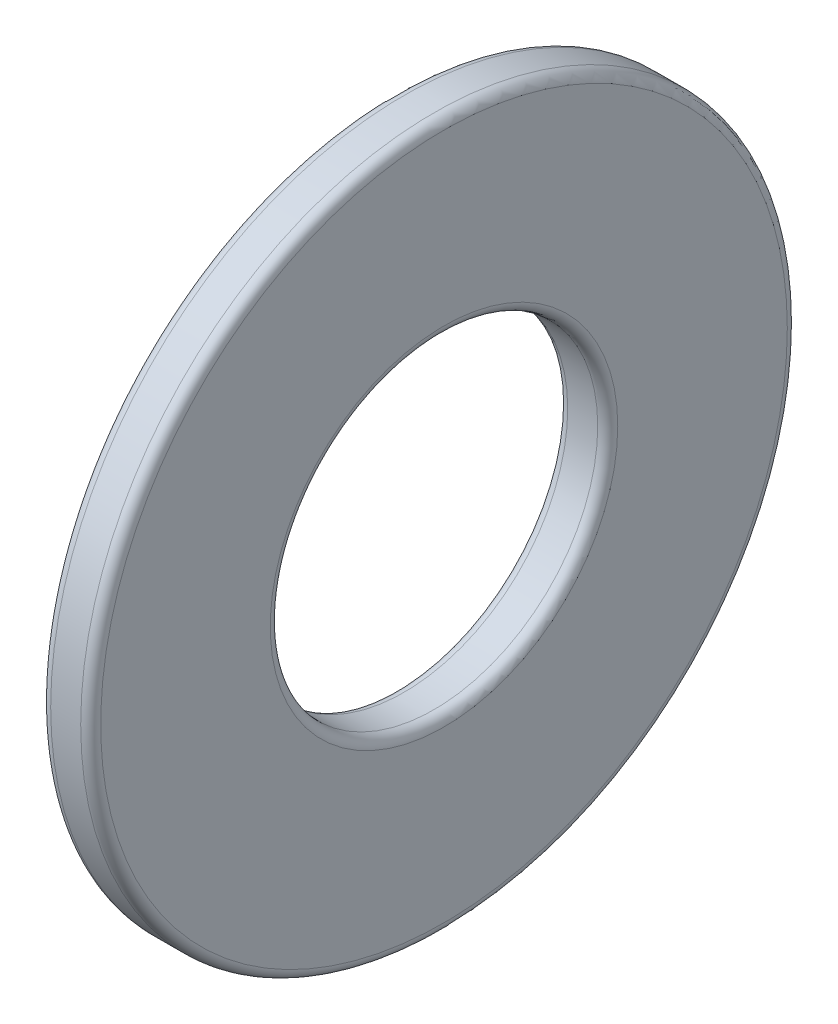
ISO-10303-21;
HEADER;
FILE_DESCRIPTION(('STEP AP214'),'2;1');
FILE_NAME('part.step','',(''),(''),'','','');
FILE_SCHEMA(('AUTOMOTIVE_DESIGN { 1 0 10303 214 1 1 1 1 }'));
ENDSEC;
DATA;
#1=APPLICATION_CONTEXT('core data for automotive mechanical design processes');
#2=APPLICATION_PROTOCOL_DEFINITION('international standard','automotive_design',2000,#1);
#3=PRODUCT_CONTEXT('',#1,'mechanical');
#4=PRODUCT('Part','Part','',(#3));
#5=PRODUCT_RELATED_PRODUCT_CATEGORY('part','',(#4));
#6=PRODUCT_DEFINITION_FORMATION('','',#4);
#7=PRODUCT_DEFINITION_CONTEXT('part definition',#1,'design');
#8=PRODUCT_DEFINITION('design','',#6,#7);
#9=PRODUCT_DEFINITION_SHAPE('','',#8);
#10=(LENGTH_UNIT() NAMED_UNIT(*) SI_UNIT(.MILLI.,.METRE.));
#11=(NAMED_UNIT(*) PLANE_ANGLE_UNIT() SI_UNIT($,.RADIAN.));
#12=(NAMED_UNIT(*) SI_UNIT($,.STERADIAN.) SOLID_ANGLE_UNIT());
#13=UNCERTAINTY_MEASURE_WITH_UNIT(LENGTH_MEASURE(1.E-05),#10,'distance_accuracy_value','');
#14=(GEOMETRIC_REPRESENTATION_CONTEXT(3) GLOBAL_UNCERTAINTY_ASSIGNED_CONTEXT((#13)) GLOBAL_UNIT_ASSIGNED_CONTEXT((#10,
#11,#12)) REPRESENTATION_CONTEXT('',''));
#15=CARTESIAN_POINT('',(0.,0.,0.));
#16=DIRECTION('',(0.,0.,1.));
#17=DIRECTION('',(1.,0.,0.));
#18=AXIS2_PLACEMENT_3D('',#15,#16,#17);
#19=CARTESIAN_POINT('',(0.3937,0.,0.));
#20=DIRECTION('',(1.,0.,0.));
#21=DIRECTION('',(0.,0.,-1.));
#22=AXIS2_PLACEMENT_3D('',#19,#20,#21);
#23=PLANE('',#22);
#24=CARTESIAN_POINT('',(0.3937,0.,0.));
#25=DIRECTION('',(1.,0.,0.));
#26=DIRECTION('',(0.,0.,-1.));
#27=AXIS2_PLACEMENT_3D('',#24,#25,#26);
#28=CIRCLE('',#27,5.40512000000002);
#29=CARTESIAN_POINT('',(0.3937,0.,-5.40512000000002));
#30=VERTEX_POINT('',#29);
#31=EDGE_CURVE('E62',#30,#30,#28,.T.);
#32=ORIENTED_EDGE('',*,*,#31,.T.);
#33=EDGE_LOOP('',(#32));
#34=FACE_BOUND('',#33,.T.);
#35=CARTESIAN_POINT('',(0.3937,0.,0.));
#36=DIRECTION('',(1.,0.,0.));
#37=DIRECTION('',(0.,0.,-1.));
#38=AXIS2_PLACEMENT_3D('',#35,#36,#37);
#39=CIRCLE('',#38,2.73558);
#40=CARTESIAN_POINT('',(0.3937,0.,-2.73558));
#41=VERTEX_POINT('',#40);
#42=EDGE_CURVE('E61',#41,#41,#39,.F.);
#43=ORIENTED_EDGE('',*,*,#42,.T.);
#44=EDGE_LOOP('',(#43));
#45=FACE_BOUND('',#44,.T.);
#46=ADVANCED_FACE('F34',(#34,#45),#23,.T.);
#47=CARTESIAN_POINT('',(-0.3937,0.,0.));
#48=DIRECTION('',(1.,0.,0.));
#49=DIRECTION('',(0.,0.,-1.));
#50=AXIS2_PLACEMENT_3D('',#47,#48,#49);
#51=PLANE('',#50);
#52=CARTESIAN_POINT('',(-0.3937,0.,0.));
#53=DIRECTION('',(1.,0.,0.));
#54=DIRECTION('',(0.,0.,-1.));
#55=AXIS2_PLACEMENT_3D('',#52,#53,#54);
#56=CIRCLE('',#55,5.40512000000002);
#57=CARTESIAN_POINT('',(-0.3937,0.,-5.40512000000002));
#58=VERTEX_POINT('',#57);
#59=EDGE_CURVE('E46',#58,#58,#56,.F.);
#60=ORIENTED_EDGE('',*,*,#59,.T.);
#61=EDGE_LOOP('',(#60));
#62=FACE_BOUND('',#61,.T.);
#63=CARTESIAN_POINT('',(-0.3937,0.,0.));
#64=DIRECTION('',(1.,0.,0.));
#65=DIRECTION('',(0.,0.,-1.));
#66=AXIS2_PLACEMENT_3D('',#63,#64,#65);
#67=CIRCLE('',#66,2.73558);
#68=CARTESIAN_POINT('',(-0.3937,0.,-2.73558));
#69=VERTEX_POINT('',#68);
#70=EDGE_CURVE('E49',#69,#69,#67,.T.);
#71=ORIENTED_EDGE('',*,*,#70,.T.);
#72=EDGE_LOOP('',(#71));
#73=FACE_BOUND('',#72,.T.);
#74=ADVANCED_FACE('F85',(#62,#73),#51,.F.);
#75=CARTESIAN_POINT('',(0.3937,0.,0.));
#76=DIRECTION('',(-1.,0.,0.));
#77=DIRECTION('',(0.,0.,1.));
#78=AXIS2_PLACEMENT_3D('',#75,#76,#77);
#79=CYLINDRICAL_SURFACE('',#78,5.56260000000002);
#80=CARTESIAN_POINT('',(0.23622,0.,0.));
#81=DIRECTION('',(1.,0.,0.));
#82=DIRECTION('',(0.,0.,-1.));
#83=AXIS2_PLACEMENT_3D('',#80,#81,#82);
#84=CIRCLE('',#83,5.56260000000002);
#85=CARTESIAN_POINT('',(0.23622,0.,-5.56260000000002));
#86=VERTEX_POINT('',#85);
#87=EDGE_CURVE('E54',#86,#86,#84,.F.);
#88=ORIENTED_EDGE('',*,*,#87,.T.);
#89=EDGE_LOOP('',(#88));
#90=FACE_BOUND('',#89,.T.);
#91=CARTESIAN_POINT('',(-0.23622,0.,0.));
#92=DIRECTION('',(1.,0.,0.));
#93=DIRECTION('',(0.,0.,-1.));
#94=AXIS2_PLACEMENT_3D('',#91,#92,#93);
#95=CIRCLE('',#94,5.56260000000002);
#96=CARTESIAN_POINT('',(-0.23622,0.,-5.56260000000002));
#97=VERTEX_POINT('',#96);
#98=EDGE_CURVE('E59',#97,#97,#95,.T.);
#99=ORIENTED_EDGE('',*,*,#98,.T.);
#100=EDGE_LOOP('',(#99));
#101=FACE_BOUND('',#100,.T.);
#102=ADVANCED_FACE('F90',(#90,#101),#79,.T.);
#103=CARTESIAN_POINT('',(0.3937,0.,0.));
#104=DIRECTION('',(-1.,0.,0.));
#105=DIRECTION('',(0.,0.,1.));
#106=AXIS2_PLACEMENT_3D('',#103,#104,#105);
#107=CYLINDRICAL_SURFACE('',#106,2.5781);
#108=CARTESIAN_POINT('',(0.23622,0.,0.));
#109=DIRECTION('',(1.,0.,0.));
#110=DIRECTION('',(0.,0.,-1.));
#111=AXIS2_PLACEMENT_3D('',#108,#109,#110);
#112=CIRCLE('',#111,2.5781);
#113=CARTESIAN_POINT('',(0.23622,0.,-2.5781));
#114=VERTEX_POINT('',#113);
#115=EDGE_CURVE('E10',#114,#114,#112,.T.);
#116=ORIENTED_EDGE('',*,*,#115,.T.);
#117=EDGE_LOOP('',(#116));
#118=FACE_BOUND('',#117,.T.);
#119=CARTESIAN_POINT('',(-0.23622,0.,0.));
#120=DIRECTION('',(1.,0.,0.));
#121=DIRECTION('',(0.,0.,-1.));
#122=AXIS2_PLACEMENT_3D('',#119,#120,#121);
#123=CIRCLE('',#122,2.5781);
#124=CARTESIAN_POINT('',(-0.23622,0.,-2.5781));
#125=VERTEX_POINT('',#124);
#126=EDGE_CURVE('E45',#125,#125,#123,.F.);
#127=ORIENTED_EDGE('',*,*,#126,.T.);
#128=EDGE_LOOP('',(#127));
#129=FACE_BOUND('',#128,.T.);
#130=ADVANCED_FACE('F95',(#118,#129),#107,.F.);
#131=CARTESIAN_POINT('',(0.23622,0.,0.));
#132=DIRECTION('',(1.,0.,0.));
#133=DIRECTION('',(0.,0.,-1.));
#134=AXIS2_PLACEMENT_3D('',#131,#132,#133);
#135=TOROIDAL_SURFACE('',#134,5.40512000000002,0.15748);
#136=ORIENTED_EDGE('',*,*,#87,.F.);
#137=EDGE_LOOP('',(#136));
#138=FACE_BOUND('',#137,.T.);
#139=ORIENTED_EDGE('',*,*,#31,.F.);
#140=EDGE_LOOP('',(#139));
#141=FACE_BOUND('',#140,.T.);
#142=ADVANCED_FACE('F76',(#138,#141),#135,.T.);
#143=CARTESIAN_POINT('',(-0.23622,0.,0.));
#144=DIRECTION('',(1.,0.,0.));
#145=DIRECTION('',(0.,0.,-1.));
#146=AXIS2_PLACEMENT_3D('',#143,#144,#145);
#147=TOROIDAL_SURFACE('',#146,5.40512000000002,0.15748);
#148=ORIENTED_EDGE('',*,*,#59,.F.);
#149=EDGE_LOOP('',(#148));
#150=FACE_BOUND('',#149,.T.);
#151=ORIENTED_EDGE('',*,*,#98,.F.);
#152=EDGE_LOOP('',(#151));
#153=FACE_BOUND('',#152,.T.);
#154=ADVANCED_FACE('F75',(#150,#153),#147,.T.);
#155=CARTESIAN_POINT('',(0.23622,0.,0.));
#156=DIRECTION('',(1.,0.,0.));
#157=DIRECTION('',(0.,0.,-1.));
#158=AXIS2_PLACEMENT_3D('',#155,#156,#157);
#159=TOROIDAL_SURFACE('',#158,2.73558,0.15748);
#160=ORIENTED_EDGE('',*,*,#42,.F.);
#161=EDGE_LOOP('',(#160));
#162=FACE_BOUND('',#161,.T.);
#163=ORIENTED_EDGE('',*,*,#115,.F.);
#164=EDGE_LOOP('',(#163));
#165=FACE_BOUND('',#164,.T.);
#166=ADVANCED_FACE('F68',(#162,#165),#159,.T.);
#167=CARTESIAN_POINT('',(-0.23622,0.,0.));
#168=DIRECTION('',(1.,0.,0.));
#169=DIRECTION('',(0.,0.,-1.));
#170=AXIS2_PLACEMENT_3D('',#167,#168,#169);
#171=TOROIDAL_SURFACE('',#170,2.73558,0.15748);
#172=ORIENTED_EDGE('',*,*,#126,.F.);
#173=EDGE_LOOP('',(#172));
#174=FACE_BOUND('',#173,.T.);
#175=ORIENTED_EDGE('',*,*,#70,.F.);
#176=EDGE_LOOP('',(#175));
#177=FACE_BOUND('',#176,.T.);
#178=ADVANCED_FACE('F40',(#174,#177),#171,.T.);
#179=CLOSED_SHELL('',(#46,#74,#102,#130,#142,#154,#166,#178));
#180=MANIFOLD_SOLID_BREP('B2',#179);
#181=ADVANCED_BREP_SHAPE_REPRESENTATION('',(#18,#180),#14);
#182=SHAPE_DEFINITION_REPRESENTATION(#9,#181);
ENDSEC;
END-ISO-10303-21;
